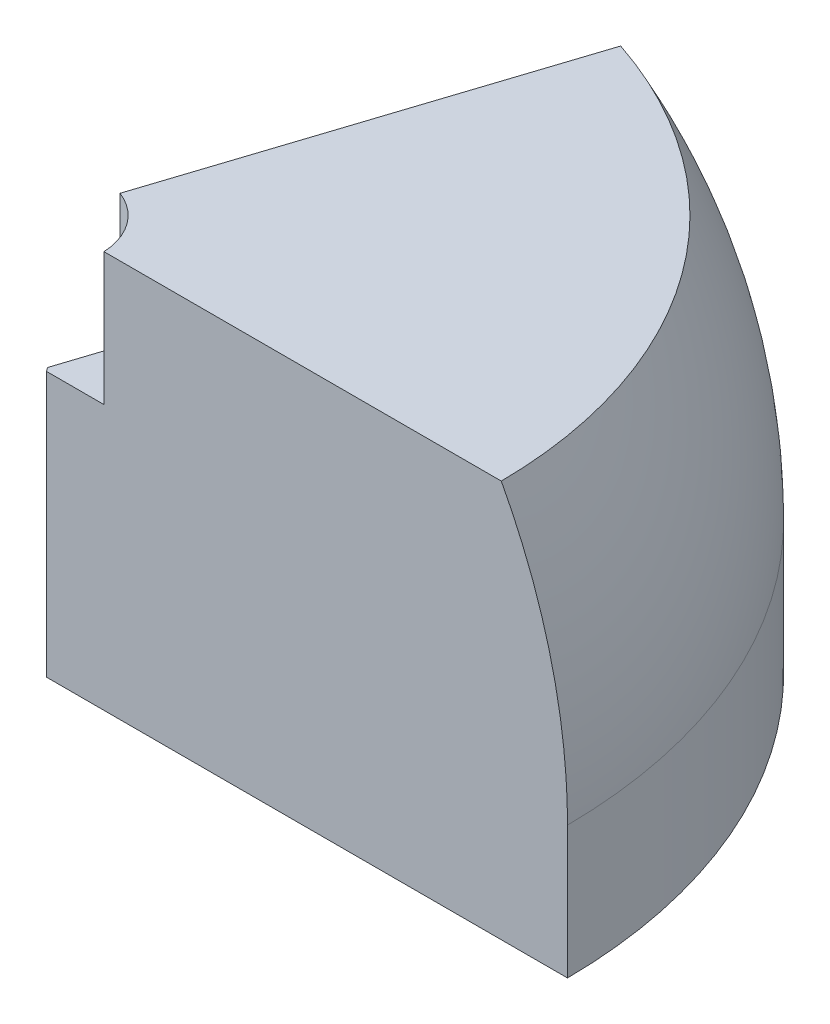
ISO-10303-21;
HEADER;
FILE_DESCRIPTION(('STEP AP214'),'2;1');
FILE_NAME('part.step','',(''),(''),'','','');
FILE_SCHEMA(('AUTOMOTIVE_DESIGN { 1 0 10303 214 1 1 1 1 }'));
ENDSEC;
DATA;
#1=APPLICATION_CONTEXT('core data for automotive mechanical design processes');
#2=APPLICATION_PROTOCOL_DEFINITION('international standard','automotive_design',2000,#1);
#3=PRODUCT_CONTEXT('',#1,'mechanical');
#4=PRODUCT('Part','Part','',(#3));
#5=PRODUCT_RELATED_PRODUCT_CATEGORY('part','',(#4));
#6=PRODUCT_DEFINITION_FORMATION('','',#4);
#7=PRODUCT_DEFINITION_CONTEXT('part definition',#1,'design');
#8=PRODUCT_DEFINITION('design','',#6,#7);
#9=PRODUCT_DEFINITION_SHAPE('','',#8);
#10=(LENGTH_UNIT() NAMED_UNIT(*) SI_UNIT(.MILLI.,.METRE.));
#11=(NAMED_UNIT(*) PLANE_ANGLE_UNIT() SI_UNIT($,.RADIAN.));
#12=(NAMED_UNIT(*) SI_UNIT($,.STERADIAN.) SOLID_ANGLE_UNIT());
#13=UNCERTAINTY_MEASURE_WITH_UNIT(LENGTH_MEASURE(1.E-05),#10,'distance_accuracy_value','');
#14=(GEOMETRIC_REPRESENTATION_CONTEXT(3) GLOBAL_UNCERTAINTY_ASSIGNED_CONTEXT((#13)) GLOBAL_UNIT_ASSIGNED_CONTEXT((#10,
#11,#12)) REPRESENTATION_CONTEXT('',''));
#15=CARTESIAN_POINT('',(0.,0.,0.));
#16=DIRECTION('',(0.,0.,1.));
#17=DIRECTION('',(1.,0.,0.));
#18=AXIS2_PLACEMENT_3D('',#15,#16,#17);
#19=CARTESIAN_POINT('',(0.,0.,0.));
#20=DIRECTION('',(0.,-1.,0.));
#21=DIRECTION('',(0.,0.,-1.));
#22=AXIS2_PLACEMENT_3D('',#19,#20,#21);
#23=PLANE('',#22);
#24=DIRECTION('',(-0.587785252292474,0.,-0.809016994374947));
#25=VECTOR('',#24,1.);
#26=CARTESIAN_POINT('',(1.65890568521156,0.,-0.635));
#27=LINE('',#26,#25);
#28=CARTESIAN_POINT('',(1.65890568521156,0.,-0.635));
#29=VERTEX_POINT('',#28);
#30=CARTESIAN_POINT('',(1.11655093664301,0.,-1.38148727041144));
#31=VERTEX_POINT('',#30);
#32=EDGE_CURVE('E93',#29,#31,#27,.T.);
#33=ORIENTED_EDGE('',*,*,#32,.T.);
#34=DIRECTION('',(-0.309016994374945,0.,0.951056516295154));
#35=VECTOR('',#34,1.);
#36=CARTESIAN_POINT('',(32.0000475163418,0.,-96.4311162641596));
#37=LINE('',#36,#35);
#38=CARTESIAN_POINT('',(31.9994343047552,0.,-96.4292289929545));
#39=VERTEX_POINT('',#38);
#40=EDGE_CURVE('E169',#39,#31,#37,.T.);
#41=ORIENTED_EDGE('',*,*,#40,.F.);
#42=CARTESIAN_POINT('',(0.,0.,0.));
#43=DIRECTION('',(0.,-1.,0.));
#44=DIRECTION('',(0.,0.,-1.));
#45=AXIS2_PLACEMENT_3D('',#42,#43,#44);
#46=CIRCLE('',#45,101.6);
#47=CARTESIAN_POINT('',(101.598015605621,0.,-0.635));
#48=VERTEX_POINT('',#47);
#49=EDGE_CURVE('E113',#39,#48,#46,.T.);
#50=ORIENTED_EDGE('',*,*,#49,.T.);
#51=DIRECTION('',(1.,0.,0.));
#52=VECTOR('',#51,1.);
#53=CARTESIAN_POINT('',(0.667678512391301,0.,-0.635));
#54=LINE('',#53,#52);
#55=EDGE_CURVE('E106',#29,#48,#54,.T.);
#56=ORIENTED_EDGE('',*,*,#55,.F.);
#57=EDGE_LOOP('',(#33,#41,#50,#56));
#58=FACE_BOUND('',#57,.T.);
#59=ADVANCED_FACE('F37',(#58),#23,.T.);
#60=CARTESIAN_POINT('',(0.,76.2,0.));
#61=DIRECTION('',(0.,1.,0.));
#62=DIRECTION('',(0.,0.,1.));
#63=AXIS2_PLACEMENT_3D('',#60,#61,#62);
#64=PLANE('',#63);
#65=CARTESIAN_POINT('',(0.,76.2,0.));
#66=DIRECTION('',(0.,1.,0.));
#67=DIRECTION('',(0.,0.,1.));
#68=AXIS2_PLACEMENT_3D('',#65,#66,#67);
#69=CIRCLE('',#68,12.7);
#70=CARTESIAN_POINT('',(12.6841150657032,76.2,-0.635));
#71=VERTEX_POINT('',#70);
#72=CARTESIAN_POINT('',(4.523528001757,76.2,-11.8670844952465));
#73=VERTEX_POINT('',#72);
#74=EDGE_CURVE('E101',#71,#73,#69,.T.);
#75=ORIENTED_EDGE('',*,*,#74,.F.);
#76=DIRECTION('',(-1.,0.,0.));
#77=VECTOR('',#76,1.);
#78=CARTESIAN_POINT('',(88.9,76.2,-0.635));
#79=LINE('',#78,#77);
#80=CARTESIAN_POINT('',(88.8977321139296,76.2,-0.635));
#81=VERTEX_POINT('',#80);
#82=EDGE_CURVE('E114',#81,#71,#79,.T.);
#83=ORIENTED_EDGE('',*,*,#82,.F.);
#84=CARTESIAN_POINT('',(0.,76.2,0.));
#85=DIRECTION('',(0.,-1.,0.));
#86=DIRECTION('',(0.,0.,-1.));
#87=AXIS2_PLACEMENT_3D('',#84,#85,#86);
#88=CIRCLE('',#87,88.9);
#89=CARTESIAN_POINT('',(28.074830872443,76.2,-84.3505416193857));
#90=VERTEX_POINT('',#89);
#91=EDGE_CURVE('E159',#90,#81,#88,.T.);
#92=ORIENTED_EDGE('',*,*,#91,.F.);
#93=DIRECTION('',(0.309016994374945,0.,-0.951056516295154));
#94=VECTOR('',#93,1.);
#95=CARTESIAN_POINT('',(0.603920887847423,76.2,0.19622579142809));
#96=LINE('',#95,#94);
#97=EDGE_CURVE('E132',#73,#90,#96,.T.);
#98=ORIENTED_EDGE('',*,*,#97,.F.);
#99=EDGE_LOOP('',(#75,#83,#92,#98));
#100=FACE_BOUND('',#99,.T.);
#101=ADVANCED_FACE('F39',(#100),#64,.T.);
#102=CARTESIAN_POINT('',(0.,25.3999999999999,0.));
#103=DIRECTION('',(0.,-1.,0.));
#104=DIRECTION('',(0.,0.,-1.));
#105=AXIS2_PLACEMENT_3D('',#102,#103,#104);
#106=DEGENERATE_TOROIDAL_SURFACE('',#105,6.35000000000034,107.95,.F.);
#107=ORIENTED_EDGE('',*,*,#91,.T.);
#108=CARTESIAN_POINT('',(95.2711124953083,61.8132104435301,-0.635));
#109=CARTESIAN_POINT('',(95.7810480913048,60.3901052430254,-0.635));
#110=CARTESIAN_POINT('',(96.2610539288999,58.9563653299823,-0.635));
#111=CARTESIAN_POINT('',(97.1603816988496,56.0701476801097,-0.635));
#112=CARTESIAN_POINT('',(97.5797119848334,54.6176725527361,-0.635));
#113=CARTESIAN_POINT('',(98.3570924929354,51.6960768749885,-0.635));
#114=CARTESIAN_POINT('',(98.7151288896013,50.226952648709,-0.635));
#115=CARTESIAN_POINT('',(99.3691924492126,47.2749056563987,-0.635));
#116=CARTESIAN_POINT('',(99.665217351682,45.7919823894152,-0.635));
#117=CARTESIAN_POINT('',(100.194988044725,42.813489364074,-0.635));
#118=CARTESIAN_POINT('',(100.428669864206,41.3179082279582,-0.635));
#119=CARTESIAN_POINT('',(100.832961619295,38.3181035771953,-0.635));
#120=CARTESIAN_POINT('',(101.003565693849,36.8138792726239,-0.635));
#121=CARTESIAN_POINT('',(101.281350844105,33.7997902496374,-0.635));
#122=CARTESIAN_POINT('',(101.388540460905,32.289926318385,-0.635));
#123=CARTESIAN_POINT('',(101.539350026058,29.2668856502316,-0.635));
#124=CARTESIAN_POINT('',(101.582964026544,27.7537086166321,-0.635));
#125=CARTESIAN_POINT('',(101.606558770675,24.7226724339604,-0.635));
#126=CARTESIAN_POINT('',(101.586363199197,23.2048119094799,-0.635));
#127=CARTESIAN_POINT('',(101.481984550683,20.1711501939732,-0.635));
#128=CARTESIAN_POINT('',(101.397795467588,18.6553492096213,-0.635));
#129=CARTESIAN_POINT('',(101.165581801395,15.6287679894556,-0.635));
#130=CARTESIAN_POINT('',(101.017562382343,14.1179873574435,-0.635));
#131=CARTESIAN_POINT('',(100.65793569996,11.1038705143466,-0.635));
#132=CARTESIAN_POINT('',(100.446322491211,9.60053501267452,-0.635));
#133=CARTESIAN_POINT('',(99.9600117756803,6.60488180603181,-0.635));
#134=CARTESIAN_POINT('',(99.6853462619025,5.11255890823832,-0.635));
#135=CARTESIAN_POINT('',(99.0733351847728,2.14068365644194,-0.635));
#136=CARTESIAN_POINT('',(98.7359837648581,0.661132509193489,-0.635));
#137=CARTESIAN_POINT('',(97.9992389774254,-2.2823157969116,-0.635));
#138=CARTESIAN_POINT('',(97.5998516885517,-3.7462144744852,-0.635));
#139=CARTESIAN_POINT('',(96.7397351060913,-6.65591946677251,-0.635));
#140=CARTESIAN_POINT('',(96.2790000748523,-8.10172407535388,-0.635));
#141=CARTESIAN_POINT('',(94.8061140089862,-12.4075415036295,-0.635));
#142=CARTESIAN_POINT('',(93.7030075102157,-15.2370540225823,-0.635));
#143=CARTESIAN_POINT('',(91.2625384569271,-20.7927697409796,-0.635));
#144=CARTESIAN_POINT('',(89.9251749119836,-23.5189725035771,-0.635));
#145=CARTESIAN_POINT('',(87.0247485377653,-28.850731769961,-0.635));
#146=CARTESIAN_POINT('',(85.4615470284069,-31.4562128343956,-0.635));
#147=CARTESIAN_POINT('',(82.1208926428598,-36.5264324326245,-0.635));
#148=CARTESIAN_POINT('',(80.343442032916,-38.9911724547173,-0.635));
#149=CARTESIAN_POINT('',(77.5263262920898,-42.5693836240272,-0.635));
#150=CARTESIAN_POINT('',(76.5617508808297,-43.7427113113559,-0.635));
#151=CARTESIAN_POINT('',(74.5839862987545,-46.0476012530404,-0.635));
#152=CARTESIAN_POINT('',(73.5708016910528,-47.1791674101202,-0.635));
#153=CARTESIAN_POINT('',(71.4974733629585,-49.3986711138708,-0.635));
#154=CARTESIAN_POINT('',(70.4373234361298,-50.4866028578701,-0.635));
#155=CARTESIAN_POINT('',(68.2721601181802,-52.6166710469498,-0.635));
#156=CARTESIAN_POINT('',(67.1671509467931,-53.6588117802965,-0.635));
#157=CARTESIAN_POINT('',(64.915757281705,-55.6940886305246,-0.635));
#158=CARTESIAN_POINT('',(63.7694340949832,-56.6872925695641,-0.635));
#159=CARTESIAN_POINT('',(61.4360701658038,-58.6244330765655,-0.635));
#160=CARTESIAN_POINT('',(60.2490332481996,-59.5683742516252,-0.635));
#161=CARTESIAN_POINT('',(57.8362949708537,-61.4053768319182,-0.635));
#162=CARTESIAN_POINT('',(56.610595114051,-62.2984402111391,-0.635));
#163=CARTESIAN_POINT('',(54.1227790601295,-64.0320604451131,-0.635));
#164=CARTESIAN_POINT('',(52.8606662755956,-64.8726221970508,-0.635));
#165=CARTESIAN_POINT('',(50.3031677600717,-66.4991937218983,-0.635));
#166=CARTESIAN_POINT('',(49.0078091501117,-67.2852461382857,-0.635));
#167=CARTESIAN_POINT('',(46.3852785619726,-68.802064205794,-0.635));
#168=CARTESIAN_POINT('',(45.0581095647242,-69.5328350108519,-0.635));
#169=CARTESIAN_POINT('',(42.3735162523584,-70.9382300778886,-0.635));
#170=CARTESIAN_POINT('',(41.0160770184915,-71.6128258422358,-0.635));
#171=CARTESIAN_POINT('',(38.2741253771229,-72.9042021911961,-0.635));
#172=CARTESIAN_POINT('',(36.8896155000491,-73.520988148649,-0.635));
#173=CARTESIAN_POINT('',(34.090998628362,-74.6977631954103,-0.635));
#174=CARTESIAN_POINT('',(32.6768054772168,-75.2575473899342,-0.635));
#175=CARTESIAN_POINT('',(29.8259722447488,-76.3168868402991,-0.635));
#176=CARTESIAN_POINT('',(28.3893312964972,-76.8164397634956,-0.635));
#177=CARTESIAN_POINT('',(25.4978982323404,-77.7538548150582,-0.635));
#178=CARTESIAN_POINT('',(24.0431288381479,-78.1917870801743,-0.635));
#179=CARTESIAN_POINT('',(21.1165479943607,-79.0058124248504,-0.635));
#180=CARTESIAN_POINT('',(19.6447388618844,-79.381913809061,-0.635));
#181=CARTESIAN_POINT('',(17.4176629879392,-79.9011915918739,-0.635));
#182=CARTESIAN_POINT('',(16.6677452932743,-80.0676230973435,-0.635));
#183=CARTESIAN_POINT('',(15.164473033656,-80.3844429117408,-0.635));
#184=CARTESIAN_POINT('',(14.411118278456,-80.5348303210866,-0.635));
#185=CARTESIAN_POINT('',(12.9001321452527,-80.8197061185371,-0.635));
#186=CARTESIAN_POINT('',(12.1424957944466,-80.9541681601784,-0.635));
#187=CARTESIAN_POINT('',(11.0041307079113,-81.1436488682889,-0.635));
#188=CARTESIAN_POINT('',(10.6244079318379,-81.2047663878569,-0.635));
#189=CARTESIAN_POINT('',(9.86433275791607,-81.3229293986458,-0.635));
#190=CARTESIAN_POINT('',(9.48398036836328,-81.3799749430871,-0.635));
#191=CARTESIAN_POINT('',(8.72511455093261,-81.4896330946228,-0.635));
#192=CARTESIAN_POINT('',(8.34660487115862,-81.5422716602101,-0.635));
#193=CARTESIAN_POINT('',(7.58902804443962,-81.643508829047,-0.635));
#194=CARTESIAN_POINT('',(7.20996087307135,-81.6921072495901,-0.635));
#195=CARTESIAN_POINT('',(6.45096617697169,-81.7852886756976,-0.635));
#196=CARTESIAN_POINT('',(6.07103817642873,-81.8298678054395,-0.635));
#197=CARTESIAN_POINT('',(5.3107825192673,-81.9149267759428,-0.635));
#198=CARTESIAN_POINT('',(4.93045493319227,-81.9554072468269,-0.635));
#199=CARTESIAN_POINT('',(4.17051371915147,-82.0321040041897,-0.635));
#200=CARTESIAN_POINT('',(3.79090133479739,-82.0683326222352,-0.635));
#201=CARTESIAN_POINT('',(3.03109637530374,-82.1365781732433,-0.635));
#202=CARTESIAN_POINT('',(2.65090360101674,-82.1685929041441,-0.635));
#203=CARTESIAN_POINT('',(2.08070271536255,-82.2130216925384,-0.635));
#204=CARTESIAN_POINT('',(1.89083256676978,-82.2272205000158,-0.635));
#205=CARTESIAN_POINT('',(1.51094383245492,-82.2542342152041,-0.635));
#206=CARTESIAN_POINT('',(1.32092522138634,-82.2670487733274,-0.635));
#207=CARTESIAN_POINT('',(1.03590773078068,-82.2846897614173,-0.635));
#208=CARTESIAN_POINT('',(0.940957870305231,-82.2903038596371,-0.635));
#209=CARTESIAN_POINT('',(0.751008737181598,-82.3007562694652,-0.635));
#210=CARTESIAN_POINT('',(0.656009461844908,-82.3055945331605,-0.635));
#211=CARTESIAN_POINT('',(0.466005110858149,-82.3140058678787,-0.635));
#212=CARTESIAN_POINT('',(0.371000068429646,-82.3175796479286,-0.635));
#213=CARTESIAN_POINT('',(0.18094157133351,-82.3225042437051,-0.635));
#214=CARTESIAN_POINT('',(0.0858881288259762,-82.3238554692885,-0.635));
#215=CARTESIAN_POINT('',(-0.0790275565434162,-82.3237130446451,-0.635));
#216=CARTESIAN_POINT('',(-0.148890681471754,-82.3228783677715,-0.635));
#217=CARTESIAN_POINT('',(-0.288590671614067,-82.319915546712,-0.635));
#218=CARTESIAN_POINT('',(-0.358427535355601,-82.3177873384468,-0.635));
#219=CARTESIAN_POINT('',(-0.498086797005905,-82.3126304026938,-0.635));
#220=CARTESIAN_POINT('',(-0.567909184774772,-82.3096014130661,-0.635));
#221=CARTESIAN_POINT('',(-0.707523514353663,-82.3029399863532,-0.635));
#222=CARTESIAN_POINT('',(-0.777315456571388,-82.299307557614,-0.635));
#223=CARTESIAN_POINT('',(-0.986777225124506,-82.2877847825757,-0.635));
#224=CARTESIAN_POINT('',(-1.12641262206724,-82.2792741418155,-0.635));
#225=CARTESIAN_POINT('',(-1.40561935127694,-82.261260355357,-0.635));
#226=CARTESIAN_POINT('',(-1.54519068274627,-82.2517571976208,-0.635));
#227=CARTESIAN_POINT('',(-1.96433217937074,-82.2220703675622,-0.635));
#228=CARTESIAN_POINT('',(-2.2438214643298,-82.2007397731893,-0.635));
#229=CARTESIAN_POINT('',(-2.8024788267206,-82.1556430414813,-0.635));
#230=CARTESIAN_POINT('',(-3.08164699105761,-82.1318779697365,-0.635));
#231=CARTESIAN_POINT('',(-3.64063974905581,-82.0819621498933,-0.635));
#232=CARTESIAN_POINT('',(-3.92046370508675,-82.0558042559793,-0.635));
#233=CARTESIAN_POINT('',(-4.47992755421622,-82.0012317646354,-0.635));
#234=CARTESIAN_POINT('',(-4.75956741903296,-81.9728168775704,-0.635));
#235=CARTESIAN_POINT('',(-5.31835277981636,-81.9137893934858,-0.635));
#236=CARTESIAN_POINT('',(-5.59749849374334,-81.8831788597321,-0.635));
#237=CARTESIAN_POINT('',(-6.15552884304028,-81.8197552845286,-0.635));
#238=CARTESIAN_POINT('',(-6.43441348785995,-81.7869423261918,-0.635));
#239=CARTESIAN_POINT('',(-6.99334841689845,-81.7189490364352,-0.635));
#240=CARTESIAN_POINT('',(-7.27339732771895,-81.6837574074854,-0.635));
#241=CARTESIAN_POINT('',(-7.83321119710798,-81.6111656013457,-0.635));
#242=CARTESIAN_POINT('',(-8.11297615252051,-81.5737653998764,-0.635));
#243=CARTESIAN_POINT('',(-8.95197431815274,-81.4582392931694,-0.635));
#244=CARTESIAN_POINT('',(-9.51075602332981,-81.3768067214924,-0.635));
#245=CARTESIAN_POINT('',(-10.6260182796668,-81.2053085766095,-0.635));
#246=CARTESIAN_POINT('',(-11.1825011276174,-81.1152579083696,-0.635));
#247=CARTESIAN_POINT('',(-12.2939352511488,-80.9264453857193,-0.635));
#248=CARTESIAN_POINT('',(-12.8488866622393,-80.8276843293187,-0.635));
#249=CARTESIAN_POINT('',(-13.9628721970605,-80.6204122150121,-0.635));
#250=CARTESIAN_POINT('',(-14.5218896073231,-80.5118113246404,-0.635));
#251=CARTESIAN_POINT('',(-15.6381500097204,-80.2857671908904,-0.635));
#252=CARTESIAN_POINT('',(-16.1953929506613,-80.1683236947676,-0.635));
#253=CARTESIAN_POINT('',(-17.3082629427017,-79.924559330632,-0.635));
#254=CARTESIAN_POINT('',(-17.8638889120226,-79.798233519811,-0.635));
#255=CARTESIAN_POINT('',(-18.9730599389536,-79.5367990096943,-0.635));
#256=CARTESIAN_POINT('',(-19.5266050134236,-79.4016903817218,-0.635));
#257=CARTESIAN_POINT('',(-21.1805117717206,-78.9840990659328,-0.635));
#258=CARTESIAN_POINT('',(-22.2776179147246,-78.6885900221431,-0.635));
#259=CARTESIAN_POINT('',(-24.4617363851326,-78.0631434918904,-0.635));
#260=CARTESIAN_POINT('',(-25.5487503610625,-77.7332117399921,-0.635));
#261=CARTESIAN_POINT('',(-28.0781530072034,-76.9216614638244,-0.635));
#262=CARTESIAN_POINT('',(-29.5162255170316,-76.4265122149214,-0.635));
#263=CARTESIAN_POINT('',(-32.3703120524934,-75.375843541916,-0.635));
#264=CARTESIAN_POINT('',(-33.7863233831151,-74.8203168071482,-0.635));
#265=CARTESIAN_POINT('',(-36.5956847396715,-73.649063723273,-0.635));
#266=CARTESIAN_POINT('',(-37.9889982993994,-73.0332498754798,-0.635));
#267=CARTESIAN_POINT('',(-40.7482667883657,-71.7432403169585,-0.635));
#268=CARTESIAN_POINT('',(-42.1142227292083,-71.0690467698653,-0.635));
#269=CARTESIAN_POINT('',(-44.8078385642773,-69.6679116782019,-0.635));
#270=CARTESIAN_POINT('',(-46.1356860132235,-68.9413306725376,-0.635));
#271=CARTESIAN_POINT('',(-48.7596628315827,-67.4329788883098,-0.635));
#272=CARTESIAN_POINT('',(-50.0557920870211,-66.6512079114689,-0.635));
#273=CARTESIAN_POINT('',(-52.6133546193354,-65.0342917413042,-0.635));
#274=CARTESIAN_POINT('',(-53.8748059774075,-64.1991751476815,-0.635));
#275=CARTESIAN_POINT('',(-56.3614976390038,-62.4766726227644,-0.635));
#276=CARTESIAN_POINT('',(-57.5867380323282,-61.5892868211096,-0.635));
#277=CARTESIAN_POINT('',(-60.0010885312287,-59.7621150380038,-0.635));
#278=CARTESIAN_POINT('',(-61.1901272589455,-58.8222347386303,-0.635));
#279=CARTESIAN_POINT('',(-63.527683174307,-56.8931646651132,-0.635));
#280=CARTESIAN_POINT('',(-64.6761968182612,-55.9039705969171,-0.635));
#281=CARTESIAN_POINT('',(-66.9306513264697,-53.8780179262939,-0.635));
#282=CARTESIAN_POINT('',(-68.0365886169272,-52.8412553469754,-0.635));
#283=CARTESIAN_POINT('',(-70.2039285673898,-50.7219825044592,-0.635));
#284=CARTESIAN_POINT('',(-71.2653270414973,-49.6394679604534,-0.635));
#285=CARTESIAN_POINT('',(-73.3439773114582,-47.4281695718086,-0.635));
#286=CARTESIAN_POINT('',(-74.3611223071742,-46.2992853308351,-0.635));
#287=CARTESIAN_POINT('',(-76.3469515283308,-43.9994835884352,-0.635));
#288=CARTESIAN_POINT('',(-77.3156311885404,-42.8285621450568,-0.635));
#289=CARTESIAN_POINT('',(-79.2025639144736,-40.4470459139958,-0.635));
#290=CARTESIAN_POINT('',(-80.1208242695115,-39.236456901831,-0.635));
#291=CARTESIAN_POINT('',(-81.9055167346122,-36.777487277962,-0.635));
#292=CARTESIAN_POINT('',(-82.7719439846736,-35.5291031389686,-0.635));
#293=CARTESIAN_POINT('',(-84.4506202248772,-32.9979495244189,-0.635));
#294=CARTESIAN_POINT('',(-85.2629145935085,-31.7152101457757,-0.635));
#295=CARTESIAN_POINT('',(-86.8327541823185,-29.1165007500258,-0.635));
#296=CARTESIAN_POINT('',(-87.5902942717655,-27.8005276343134,-0.635));
#297=CARTESIAN_POINT('',(-89.0491462283248,-25.1378809162212,-0.635));
#298=CARTESIAN_POINT('',(-89.7504625783451,-23.7912097725169,-0.635));
#299=CARTESIAN_POINT('',(-91.0957075148148,-21.0694607104991,-0.635));
#300=CARTESIAN_POINT('',(-91.7396307311013,-19.6943801487689,-0.635));
#301=CARTESIAN_POINT('',(-93.5823765856159,-15.5327169491882,-0.635));
#302=CARTESIAN_POINT('',(-94.6937775227184,-12.7067876783074,-0.635));
#303=CARTESIAN_POINT('',(-96.6745010355704,-6.97177465527589,-0.635));
#304=CARTESIAN_POINT('',(-97.543824709381,-4.06269128037779,-0.635));
#305=CARTESIAN_POINT('',(-99.0346746809904,1.81928837192862,-0.635));
#306=CARTESIAN_POINT('',(-99.6561302749467,4.79220260247231,-0.635));
#307=CARTESIAN_POINT('',(-100.646410233531,10.7797890304668,-0.635));
#308=CARTESIAN_POINT('',(-101.015234170382,13.794461298617,-0.635));
#309=CARTESIAN_POINT('',(-101.497707994757,19.8449595182587,-0.635));
#310=CARTESIAN_POINT('',(-101.611291012634,22.8807908042123,-0.635));
#311=CARTESIAN_POINT('',(-101.582273581143,28.9512259274789,-0.635));
#312=CARTESIAN_POINT('',(-101.439673194515,31.9858297650924,-0.635));
#313=CARTESIAN_POINT('',(-100.899320099634,38.0320584867742,-0.635));
#314=CARTESIAN_POINT('',(-100.501582150748,41.0436846898712,-0.635));
#315=CARTESIAN_POINT('',(-99.4537954829564,47.0227213951505,-0.635));
#316=CARTESIAN_POINT('',(-98.8037467587013,49.9901318963954,-0.635));
#317=CARTESIAN_POINT('',(-97.2560729544157,55.8592123066664,-0.635));
#318=CARTESIAN_POINT('',(-96.3584837268165,58.7608916700271,-0.635));
#319=CARTESIAN_POINT('',(-94.3220694035657,64.4783261937802,-0.635));
#320=CARTESIAN_POINT('',(-93.18324444786,67.2940814040179,-0.635));
#321=CARTESIAN_POINT('',(-90.67251528456,72.8195178116754,-0.635));
#322=CARTESIAN_POINT('',(-89.3006225398616,75.5292042177816,-0.635));
#323=CARTESIAN_POINT('',(-86.3334674521962,80.8233941420738,-0.635));
#324=CARTESIAN_POINT('',(-84.7382047313831,83.4078974484938,-0.635));
#325=CARTESIAN_POINT('',(-81.3352345309942,88.4339596698516,-0.635));
#326=CARTESIAN_POINT('',(-79.527475344171,90.8754835758538,-0.635));
#327=CARTESIAN_POINT('',(-75.7126898766286,95.597527957486,-0.635));
#328=CARTESIAN_POINT('',(-73.7056647063437,97.8780493302014,-0.635));
#329=CARTESIAN_POINT('',(-69.5064234839253,102.2620820063,-0.635));
#330=CARTESIAN_POINT('',(-67.3141909435914,104.365577516501,-0.635));
#331=CARTESIAN_POINT('',(-62.7602315711704,108.380413176579,-0.635));
#332=CARTESIAN_POINT('',(-60.398501110138,110.291749210223,-0.635));
#333=CARTESIAN_POINT('',(-55.5233893427259,113.907875066912,-0.635));
#334=CARTESIAN_POINT('',(-53.0100707409192,115.612749427062,-0.635));
#335=CARTESIAN_POINT('',(-47.848963388213,118.804623885265,-0.635));
#336=CARTESIAN_POINT('',(-45.2011851158756,120.291640926151,-0.635));
#337=CARTESIAN_POINT('',(-39.7893528742326,123.037616299638,-0.635));
#338=CARTESIAN_POINT('',(-37.025279438881,124.296536263609,-0.635));
#339=CARTESIAN_POINT('',(-31.4001027764286,126.577375395366,-0.635));
#340=CARTESIAN_POINT('',(-28.5389736438028,127.599230707592,-0.635));
#341=CARTESIAN_POINT('',(-22.7403241250101,129.398361818582,-0.635));
#342=CARTESIAN_POINT('',(-19.8027872488296,130.175584339492,-0.635));
#343=CARTESIAN_POINT('',(-13.8746373767884,131.479160851853,-0.635));
#344=CARTESIAN_POINT('',(-10.8840740957542,132.005738143516,-0.635));
#345=CARTESIAN_POINT('',(-7.22271718175602,132.491855890683,-0.635));
#346=CARTESIAN_POINT('',(-6.56686894586874,132.572782295864,-0.635));
#347=CARTESIAN_POINT('',(-5.25342837060698,132.722495405253,-0.635));
#348=CARTESIAN_POINT('',(-4.59583534368585,132.791276247474,-0.635));
#349=CARTESIAN_POINT('',(-3.77361105212141,132.869372950466,-0.635));
#350=CARTESIAN_POINT('',(-3.60952056697888,132.884565896573,-0.635));
#351=CARTESIAN_POINT('',(-3.28126650505741,132.914155833571,-0.635));
#352=CARTESIAN_POINT('',(-3.11710292797585,132.928552821135,-0.635));
#353=CARTESIAN_POINT('',(-2.78865518440501,132.95653176667,-0.635));
#354=CARTESIAN_POINT('',(-2.62437099631104,132.970113470681,-0.635));
#355=CARTESIAN_POINT('',(-2.29573807103158,132.996409711731,-0.635));
#356=CARTESIAN_POINT('',(-2.13138933591043,133.009124274538,-0.635));
#357=CARTESIAN_POINT('',(-1.80280367336048,133.033583174219,-0.635));
#358=CARTESIAN_POINT('',(-1.6385668259642,133.045328578475,-0.635));
#359=CARTESIAN_POINT('',(-1.39213909996481,133.062050748506,-0.635));
#360=CARTESIAN_POINT('',(-1.30997860663919,133.0674758362,-0.635));
#361=CARTESIAN_POINT('',(-1.14563442011722,133.077959644019,-0.635));
#362=CARTESIAN_POINT('',(-1.06345072701103,133.083018365549,-0.635));
#363=CARTESIAN_POINT('',(-0.899107669961999,133.092652372784,-0.635));
#364=CARTESIAN_POINT('',(-0.816948324287882,133.097227966857,-0.635));
#365=CARTESIAN_POINT('',(-0.652590097788548,133.105682180429,-0.635));
#366=CARTESIAN_POINT('',(-0.570391215669501,133.109560775306,-0.635));
#367=CARTESIAN_POINT('',(-0.405973378324718,133.116214669494,-0.635));
#368=CARTESIAN_POINT('',(-0.323754438569106,133.118990330907,-0.635));
#369=CARTESIAN_POINT('',(-0.159284161631871,133.122791348222,-0.635));
#370=CARTESIAN_POINT('',(-0.0770328314558424,133.123816975618,-0.635));
#371=CARTESIAN_POINT('',(0.0721820220989415,133.123743143543,-0.635));
#372=CARTESIAN_POINT('',(0.139145855540466,133.123003200317,-0.635));
#373=CARTESIAN_POINT('',(0.273050250760686,133.120313408143,-0.635));
#374=CARTESIAN_POINT('',(0.339990811401848,133.118363506627,-0.635));
#375=CARTESIAN_POINT('',(0.47385416523448,133.113601677355,-0.635));
#376=CARTESIAN_POINT('',(0.540776951558924,133.11078956523,-0.635));
#377=CARTESIAN_POINT('',(0.674593867365537,133.10457817551,-0.635));
#378=CARTESIAN_POINT('',(0.741487997157206,133.101178904424,-0.635));
#379=CARTESIAN_POINT('',(0.942231051443081,133.09037103298,-0.635));
#380=CARTESIAN_POINT('',(1.07604702732504,133.082356282468,-0.635));
#381=CARTESIAN_POINT('',(1.34360098289807,133.065367339481,-0.635));
#382=CARTESIAN_POINT('',(1.47733896975098,133.056393256677,-0.635));
#383=CARTESIAN_POINT('',(1.87893559574853,133.028353618548,-0.635));
#384=CARTESIAN_POINT('',(2.146718393954,133.008197699487,-0.635));
#385=CARTESIAN_POINT('',(2.68200466940328,132.965615336843,-0.635));
#386=CARTESIAN_POINT('',(2.94950821240516,132.943189710817,-0.635));
#387=CARTESIAN_POINT('',(3.48517799654182,132.896127512143,-0.635));
#388=CARTESIAN_POINT('',(3.75334364045499,132.87148413646,-0.635));
#389=CARTESIAN_POINT('',(4.28950410658832,132.820116932605,-0.635));
#390=CARTESIAN_POINT('',(4.55749890761437,132.793392883508,-0.635));
#391=CARTESIAN_POINT('',(5.09304637274005,132.737920110243,-0.635));
#392=CARTESIAN_POINT('',(5.36059921888897,132.709173144771,-0.635));
#393=CARTESIAN_POINT('',(5.89547028396929,132.649652788618,-0.635));
#394=CARTESIAN_POINT('',(6.1627885099964,132.618879461523,-0.635));
#395=CARTESIAN_POINT('',(6.96736867091704,132.523179882824,-0.635));
#396=CARTESIAN_POINT('',(7.50426880919331,132.455183582086,-0.635));
#397=CARTESIAN_POINT('',(8.57712529030077,132.311067667883,-0.635));
#398=CARTESIAN_POINT('',(9.11308133338082,132.234945828233,-0.635));
#399=CARTESIAN_POINT('',(10.182837773443,132.074767875751,-0.635));
#400=CARTESIAN_POINT('',(10.7166403065419,131.99072603619,-0.635));
#401=CARTESIAN_POINT('',(11.7828735937276,131.814629842695,-0.635));
#402=CARTESIAN_POINT('',(12.3153044643374,131.722576194138,-0.635));
#403=CARTESIAN_POINT('',(13.3848233032018,131.529373148859,-0.635));
#404=CARTESIAN_POINT('',(13.9218946117549,131.428131507286,-0.635));
#405=CARTESIAN_POINT('',(14.9944507392931,131.217493556122,-0.635));
#406=CARTESIAN_POINT('',(15.5299355138286,131.108097020262,-0.635));
#407=CARTESIAN_POINT('',(16.5995028470587,130.881110242614,-0.635));
#408=CARTESIAN_POINT('',(17.1335843716172,130.76351512386,-0.635));
#409=CARTESIAN_POINT('',(18.199888533812,130.520220682532,-0.635));
#410=CARTESIAN_POINT('',(18.7321111860747,130.394521423877,-0.635));
#411=CARTESIAN_POINT('',(20.32213090543,130.00620867067,-0.635));
#412=CARTESIAN_POINT('',(21.377024677903,129.731585196092,-0.635));
#413=CARTESIAN_POINT('',(23.4777860586028,129.150572335328,-0.635));
#414=CARTESIAN_POINT('',(24.5236552648807,128.844188703622,-0.635));
#415=CARTESIAN_POINT('',(27.0177843677307,128.072339306415,-0.635));
#416=CARTESIAN_POINT('',(28.4614442825478,127.591910643787,-0.635));
#417=CARTESIAN_POINT('',(31.3273318745514,126.570406088448,-0.635));
#418=CARTESIAN_POINT('',(32.7495566220874,126.029321989419,-0.635));
#419=CARTESIAN_POINT('',(35.5723020279832,124.886533803611,-0.635));
#420=CARTESIAN_POINT('',(36.9727810636421,124.284726865307,-0.635));
#421=CARTESIAN_POINT('',(39.7469418463873,123.022380582145,-0.635));
#422=CARTESIAN_POINT('',(41.1206247111053,122.361843693246,-0.635));
#423=CARTESIAN_POINT('',(43.8286996783362,120.988320050552,-0.635));
#424=CARTESIAN_POINT('',(45.1633077687953,120.275759106784,-0.635));
#425=CARTESIAN_POINT('',(47.8014046266443,118.795176846769,-0.635));
#426=CARTESIAN_POINT('',(49.1048932857839,118.027155337639,-0.635));
#427=CARTESIAN_POINT('',(51.6776157268933,116.437522837931,-0.635));
#428=CARTESIAN_POINT('',(52.9468709840597,115.615946603223,-0.635));
#429=CARTESIAN_POINT('',(55.4497534296433,113.920215633145,-0.635));
#430=CARTESIAN_POINT('',(56.6833807224412,113.046061051838,-0.635));
#431=CARTESIAN_POINT('',(59.1159526283389,111.244404271234,-0.635));
#432=CARTESIAN_POINT('',(60.3148001093398,110.31677092137,-0.635));
#433=CARTESIAN_POINT('',(62.6724770691583,108.411765557432,-0.635));
#434=CARTESIAN_POINT('',(63.8313030214006,107.434389178829,-0.635));
#435=CARTESIAN_POINT('',(66.1069444204762,105.431553658402,-0.635));
#436=CARTESIAN_POINT('',(67.2237534380015,104.406087211473,-0.635));
#437=CARTESIAN_POINT('',(69.4133184663143,102.308909322436,-0.635));
#438=CARTESIAN_POINT('',(70.4860693931532,101.237192572514,-0.635));
#439=CARTESIAN_POINT('',(72.5876946582178,99.0472159005977,-0.635));
#440=CARTESIAN_POINT('',(73.6164716392084,97.9288625424783,-0.635));
#441=CARTESIAN_POINT('',(75.6257888436444,95.649861782934,-0.635));
#442=CARTESIAN_POINT('',(76.6063344621856,94.4892191373307,-0.635));
#443=CARTESIAN_POINT('',(78.5174224879801,92.1277593932023,-0.635));
#444=CARTESIAN_POINT('',(79.4479730212577,90.9269488752178,-0.635));
#445=CARTESIAN_POINT('',(81.2575051387454,88.4872407934417,-0.635));
#446=CARTESIAN_POINT('',(82.1364885245954,87.2483445625866,-0.635));
#447=CARTESIAN_POINT('',(84.261492087424,84.1151065997551,-0.635));
#448=CARTESIAN_POINT('',(85.4750240058764,82.1985177039443,-0.635));
#449=CARTESIAN_POINT('',(87.202659416868,79.2697986714063,-0.635));
#450=CARTESIAN_POINT('',(87.7630663740922,78.284641046658,-0.635));
#451=CARTESIAN_POINT('',(88.8526701570979,76.2970192960934,-0.635));
#452=CARTESIAN_POINT('',(89.3818625785555,75.2945527536886,-0.635));
#453=CARTESIAN_POINT('',(90.9206754773388,72.2648512399464,-0.635));
#454=CARTESIAN_POINT('',(91.8827589883532,70.2132332946207,-0.635));
#455=CARTESIAN_POINT('',(93.6759975784986,66.0534394843506,-0.635));
#456=CARTESIAN_POINT('',(94.5071437767272,63.9452597944112,-0.635));
#457=CARTESIAN_POINT('',(95.2711124953083,61.8132104435301,-0.635));
#458=B_SPLINE_CURVE_WITH_KNOTS('',3,(#108,#109,#110,#111,#112,#113,#114,#115,#116,#117,#118,
#119,#120,#121,#122,#123,#124,#125,#126,#127,#128,#129,#130,#131,#132,#133,#134,#135,#136,#137,
#138,#139,#140,#141,#142,#143,#144,#145,#146,#147,#148,#149,#150,#151,#152,#153,#154,#155,#156,
#157,#158,#159,#160,#161,#162,#163,#164,#165,#166,#167,#168,#169,#170,#171,#172,#173,#174,#175,
#176,#177,#178,#179,#180,#181,#182,#183,#184,#185,#186,#187,#188,#189,#190,#191,#192,#193,#194,
#195,#196,#197,#198,#199,#200,#201,#202,#203,#204,#205,#206,#207,#208,#209,#210,#211,#212,#213,
#214,#215,#216,#217,#218,#219,#220,#221,#222,#223,#224,#225,#226,#227,#228,#229,#230,#231,#232,
#233,#234,#235,#236,#237,#238,#239,#240,#241,#242,#243,#244,#245,#246,#247,#248,#249,#250,#251,
#252,#253,#254,#255,#256,#257,#258,#259,#260,#261,#262,#263,#264,#265,#266,#267,#268,#269,#270,
#271,#272,#273,#274,#275,#276,#277,#278,#279,#280,#281,#282,#283,#284,#285,#286,#287,#288,#289,
#290,#291,#292,#293,#294,#295,#296,#297,#298,#299,#300,#301,#302,#303,#304,#305,#306,#307,#308,
#309,#310,#311,#312,#313,#314,#315,#316,#317,#318,#319,#320,#321,#322,#323,#324,#325,#326,#327,
#328,#329,#330,#331,#332,#333,#334,#335,#336,#337,#338,#339,#340,#341,#342,#343,#344,#345,#346,
#347,#348,#349,#350,#351,#352,#353,#354,#355,#356,#357,#358,#359,#360,#361,#362,#363,#364,#365,
#366,#367,#368,#369,#370,#371,#372,#373,#374,#375,#376,#377,#378,#379,#380,#381,#382,#383,#384,
#385,#386,#387,#388,#389,#390,#391,#392,#393,#394,#395,#396,#397,#398,#399,#400,#401,#402,#403,
#404,#405,#406,#407,#408,#409,#410,#411,#412,#413,#414,#415,#416,#417,#418,#419,#420,#421,#422,
#423,#424,#425,#426,#427,#428,#429,#430,#431,#432,#433,#434,#435,#436,#437,#438,#439,#440,#441,
#442,#443,#444,#445,#446,#447,#448,#449,#450,#451,#452,#453,#454,#455,#456,#457),.UNSPECIFIED.,
.T.,.F.,(4,2,2,2,2,2,2,2,2,2,2,2,2,2,2,2,2,2,2,2,2,2,2,2,2,2,2,2,2,2,2,2,2,2,2,2,2,2,2,2,2,2,2,
2,2,2,2,2,2,2,2,2,2,2,2,2,2,2,2,2,2,2,2,2,2,2,2,2,2,2,2,2,2,2,2,2,2,2,2,2,2,2,2,2,2,2,2,2,2,2,2,
2,2,2,2,2,2,2,2,2,2,2,2,2,2,2,2,2,2,2,2,2,2,2,2,2,2,2,2,2,2,2,2,2,2,2,2,2,2,2,2,2,2,2,2,2,2,2,2,
2,2,2,2,2,2,2,2,2,2,2,2,2,2,2,2,2,2,2,2,2,2,2,2,2,2,2,2,2,2,2,2,2,2,2,4),(0.,4.5346457163523,
9.06866652094642,13.6037086758376,18.1389161157334,22.6787594497122,27.2190245106044,
31.7586779179742,36.2987560089906,40.8513899554518,45.4044512384853,49.9571442357737,
54.5102629992741,59.0610765777633,63.6123155395634,68.1631088248342,72.7143280301663,
81.8133873963876,90.9124852338347,100.017194483276,109.121807435041,113.677445445155,
118.232656635367,122.788471599963,127.34385900535,131.892744416956,136.441203647554,
140.989486283909,145.537344035418,150.081602826182,154.625437429561,159.171563255601,
163.71726614516,168.278771126394,172.840452709467,177.396899434983,181.95273367257,
184.257080834698,186.561557132199,188.869794154383,190.023605493203,191.177401749011,
192.323837296284,193.470324660397,194.617906020859,195.765310684832,196.909300708919,
198.053886197219,198.625084084928,199.196425891233,199.481771003774,199.767133731451,
200.052336194714,200.33748605847,200.547075082214,200.756674489479,200.966334952866,
201.175992516736,201.595669066283,202.01535070651,202.856241776683,203.696766342155,
204.53988849914,205.383119027581,206.225567292642,207.067983784034,207.914728693389,
208.761482912969,210.455459138452,212.146556835726,213.837499762207,215.545834204438,
217.254217493817,218.963559101157,220.672886829036,224.080881111316,227.488308551147,
232.049669190923,236.611582748889,241.180218342165,245.748684687697,250.288260233718,
254.827852089611,259.365030276354,263.90219721033,268.447796213895,272.993791724378,
277.540167990761,282.086970587201,286.644198179279,291.201854237967,295.758849634239,
300.316271638258,304.869823900885,309.423802300919,313.977417235047,318.531457795687,
327.629565396077,336.727631726829,345.828291408798,354.928966500726,364.032025567857,
373.13508240566,382.237612691247,391.340143169825,400.441355978726,409.542563507833,
418.643323544778,427.74409897648,436.847093522704,445.950037344212,455.053792416608,
464.157742458305,473.257952132148,482.357453703622,491.458484500799,500.561963906033,
509.667424561594,518.764757894594,520.747189262409,522.730574839799,523.224951415012,
523.719330056412,524.213861905052,524.708379050701,525.202344081055,525.44936171254,
525.696378397043,525.943236451583,526.190103224722,526.436888882656,526.683636251807,
526.884526436266,527.085425349114,527.286367250791,527.487306924566,527.889467334492,
528.291581818787,529.097188615181,529.902506254805,530.710384415897,531.518348474205,
532.32561857699,533.132863360413,534.756361824179,536.380306231533,538.001378014381,
539.622307218843,541.261834813008,542.901407915027,544.541964786522,546.182508720128,
549.452116096895,552.721132100288,557.284199891844,561.847885785946,566.419435657942,
570.990794447373,575.528214277634,580.065649889207,584.600169568014,589.134675960515,
593.680819411268,598.227362437524,602.774598356113,607.322357523205,611.879712616103,
616.436556764619,620.9926580051,625.54859997076,632.348808804053,635.748545962725,
639.148761677306,645.941958016655,652.735614910464),.UNSPECIFIED.);
#459=CARTESIAN_POINT('',(101.598015605621,25.4,-0.635));
#460=VERTEX_POINT('',#459);
#461=EDGE_CURVE('E126',#81,#460,#458,.T.);
#462=ORIENTED_EDGE('',*,*,#461,.T.);
#463=CARTESIAN_POINT('',(0.,25.4,0.));
#464=DIRECTION('',(0.,-1.,0.));
#465=DIRECTION('',(0.,0.,-1.));
#466=AXIS2_PLACEMENT_3D('',#463,#464,#465);
#467=CIRCLE('',#466,101.6);
#468=CARTESIAN_POINT('',(31.9994343047552,25.4,-96.4292289929545));
#469=VERTEX_POINT('',#468);
#470=EDGE_CURVE('E156',#469,#460,#467,.T.);
#471=ORIENTED_EDGE('',*,*,#470,.F.);
#472=CARTESIAN_POINT('',(31.9994343046979,25.3998,-96.4292289927783));
#473=CARTESIAN_POINT('',(31.9994417586177,26.9324463851088,-96.4292519335845));
#474=CARTESIAN_POINT('',(31.989349741781,28.4650914652759,-96.3981918995093));
#475=CARTESIAN_POINT('',(31.9490137204242,31.5276186988383,-96.2740503906243));
#476=CARTESIAN_POINT('',(31.9187695014563,33.0575008226582,-96.1809682558122));
#477=CARTESIAN_POINT('',(31.838161048792,36.1122768812056,-95.9328809480902));
#478=CARTESIAN_POINT('',(31.7877893384578,37.6371687497806,-95.7778527644549));
#479=CARTESIAN_POINT('',(31.6670201370774,40.6786048555945,-95.4061633815688));
#480=CARTESIAN_POINT('',(31.5966229368096,42.1951492137166,-95.1895030772416));
#481=CARTESIAN_POINT('',(31.4375506555761,45.186678844504,-94.6999289360683));
#482=CARTESIAN_POINT('',(31.349272790096,46.6618854724898,-94.4282376027831));
#483=CARTESIAN_POINT('',(31.1537671297582,49.5990889057013,-93.8265330505367));
#484=CARTESIAN_POINT('',(31.0465393803116,51.061085742574,-93.4965199713368));
#485=CARTESIAN_POINT('',(30.8133721170771,53.9686834317406,-92.7789049238717));
#486=CARTESIAN_POINT('',(30.6874408086877,55.4142911762188,-92.3913282092267));
#487=CARTESIAN_POINT('',(30.4170632479685,58.2871119455904,-91.5591916417795));
#488=CARTESIAN_POINT('',(30.2726188383068,59.71432678565,-91.1146374601269));
#489=CARTESIAN_POINT('',(29.9792651313207,62.4206399795265,-90.2117875855664));
#490=CARTESIAN_POINT('',(29.8319239980915,63.7015214879205,-89.7583182054781));
#491=CARTESIAN_POINT('',(29.5223509559072,66.2440055331829,-88.805550349994));
#492=CARTESIAN_POINT('',(29.3601220870842,67.5056119449921,-88.3062612311629));
#493=CARTESIAN_POINT('',(29.0193944806147,70.019693287576,-87.2576094860708));
#494=CARTESIAN_POINT('',(28.8407577101563,71.2719723187068,-86.7078220384966));
#495=CARTESIAN_POINT('',(28.4687537882867,73.7537217174616,-85.5629116923941));
#496=CARTESIAN_POINT('',(28.2753836249346,74.9831873571279,-84.9677795240644));
#497=CARTESIAN_POINT('',(28.074797909706,76.2002,-84.3504401705128));
#498=B_SPLINE_CURVE_WITH_KNOTS('',3,(#472,#473,#474,#475,#476,#477,#478,#479,#480,#481,#482,
#483,#484,#485,#486,#487,#488,#489,#490,#491,#492,#493,#494,#495,#496,#497),.UNSPECIFIED.,.F.,
.F.,(4,2,2,2,2,2,2,2,2,2,2,2,4),(0.,4.59758936218162,9.1952276499555,13.7945753847618,
18.3938563385685,22.9003891757954,27.406911213789,31.9114620131943,36.4155648079203,
40.5148420711945,44.6132841012702,48.7500750510301,52.8877139639548),.UNSPECIFIED.);
#499=EDGE_CURVE('E60',#469,#90,#498,.T.);
#500=ORIENTED_EDGE('',*,*,#499,.T.);
#501=EDGE_LOOP('',(#107,#462,#471,#500));
#502=FACE_BOUND('',#501,.T.);
#503=ADVANCED_FACE('F134',(#502),#106,.F.);
#504=CARTESIAN_POINT('',(0.,0.,0.));
#505=DIRECTION('',(0.,-1.,0.));
#506=DIRECTION('',(0.,0.,-1.));
#507=AXIS2_PLACEMENT_3D('',#504,#505,#506);
#508=CYLINDRICAL_SURFACE('',#507,101.6);
#509=ORIENTED_EDGE('',*,*,#470,.T.);
#510=DIRECTION('',(0.,-1.,0.));
#511=VECTOR('',#510,1.);
#512=CARTESIAN_POINT('',(101.598015605621,0.,-0.635));
#513=LINE('',#512,#511);
#514=EDGE_CURVE('E118',#460,#48,#513,.T.);
#515=ORIENTED_EDGE('',*,*,#514,.T.);
#516=ORIENTED_EDGE('',*,*,#49,.F.);
#517=DIRECTION('',(0.,-1.,0.));
#518=VECTOR('',#517,1.);
#519=CARTESIAN_POINT('',(31.9994343047552,0.,-96.4292289929545));
#520=LINE('',#519,#518);
#521=EDGE_CURVE('E154',#39,#469,#520,.F.);
#522=ORIENTED_EDGE('',*,*,#521,.T.);
#523=EDGE_LOOP('',(#509,#515,#516,#522));
#524=FACE_BOUND('',#523,.T.);
#525=ADVANCED_FACE('F147',(#524),#508,.T.);
#526=CARTESIAN_POINT('',(-1.35833702643358,25.3999999999999,6.23543466990265));
#527=DIRECTION('',(-0.951056516295154,0.,-0.309016994374945));
#528=DIRECTION('',(-0.309016994374945,0.,0.951056516295154));
#529=AXIS2_PLACEMENT_3D('',#526,#527,#528);
#530=PLANE('',#529);
#531=DIRECTION('',(0.,1.,0.));
#532=VECTOR('',#531,1.);
#533=CARTESIAN_POINT('',(1.11655093664301,-0.001000000000001,-1.38148727041144));
#534=LINE('',#533,#532);
#535=CARTESIAN_POINT('',(1.11655093664301,50.8,-1.38148727041144));
#536=VERTEX_POINT('',#535);
#537=EDGE_CURVE('E96',#31,#536,#534,.T.);
#538=ORIENTED_EDGE('',*,*,#537,.T.);
#539=DIRECTION('',(0.309016994374945,0.,-0.951056516295154));
#540=VECTOR('',#539,1.);
#541=CARTESIAN_POINT('',(-1.35833702643358,50.8,6.23543466990265));
#542=LINE('',#541,#540);
#543=CARTESIAN_POINT('',(4.523528001757,50.8,-11.8670844952465));
#544=VERTEX_POINT('',#543);
#545=EDGE_CURVE('E121',#536,#544,#542,.T.);
#546=ORIENTED_EDGE('',*,*,#545,.T.);
#547=DIRECTION('',(0.,1.,0.));
#548=VECTOR('',#547,1.);
#549=CARTESIAN_POINT('',(4.523528001757,50.8,-11.8670844952465));
#550=LINE('',#549,#548);
#551=EDGE_CURVE('E115',#73,#544,#550,.F.);
#552=ORIENTED_EDGE('',*,*,#551,.F.);
#553=ORIENTED_EDGE('',*,*,#97,.T.);
#554=ORIENTED_EDGE('',*,*,#499,.F.);
#555=ORIENTED_EDGE('',*,*,#521,.F.);
#556=ORIENTED_EDGE('',*,*,#40,.T.);
#557=EDGE_LOOP('',(#538,#546,#552,#553,#554,#555,#556));
#558=FACE_BOUND('',#557,.T.);
#559=ADVANCED_FACE('F142',(#558),#530,.T.);
#560=CARTESIAN_POINT('',(-6.35000000000034,25.3999999999999,-0.635));
#561=DIRECTION('',(0.,0.,1.));
#562=DIRECTION('',(1.,0.,0.));
#563=AXIS2_PLACEMENT_3D('',#560,#561,#562);
#564=PLANE('',#563);
#565=DIRECTION('',(0.,1.,0.));
#566=VECTOR('',#565,1.);
#567=CARTESIAN_POINT('',(1.65890568521156,-0.001000000000001,-0.635));
#568=LINE('',#567,#566);
#569=CARTESIAN_POINT('',(1.65890568521156,50.8,-0.635000000000001));
#570=VERTEX_POINT('',#569);
#571=EDGE_CURVE('E52',#29,#570,#568,.T.);
#572=ORIENTED_EDGE('',*,*,#571,.F.);
#573=ORIENTED_EDGE('',*,*,#55,.T.);
#574=ORIENTED_EDGE('',*,*,#514,.F.);
#575=ORIENTED_EDGE('',*,*,#461,.F.);
#576=ORIENTED_EDGE('',*,*,#82,.T.);
#577=DIRECTION('',(0.,1.,0.));
#578=VECTOR('',#577,1.);
#579=CARTESIAN_POINT('',(12.6841150657032,50.8,-0.635));
#580=LINE('',#579,#578);
#581=CARTESIAN_POINT('',(12.6841150657032,50.8,-0.635));
#582=VERTEX_POINT('',#581);
#583=EDGE_CURVE('E11',#582,#71,#580,.T.);
#584=ORIENTED_EDGE('',*,*,#583,.F.);
#585=DIRECTION('',(-1.,0.,0.));
#586=VECTOR('',#585,1.);
#587=CARTESIAN_POINT('',(-6.35000000000034,50.8,-0.635));
#588=LINE('',#587,#586);
#589=EDGE_CURVE('E45',#582,#570,#588,.T.);
#590=ORIENTED_EDGE('',*,*,#589,.T.);
#591=EDGE_LOOP('',(#572,#573,#574,#575,#576,#584,#590));
#592=FACE_BOUND('',#591,.T.);
#593=ADVANCED_FACE('F105',(#592),#564,.T.);
#594=CARTESIAN_POINT('',(0.,50.8,0.));
#595=DIRECTION('',(0.,1.,0.));
#596=DIRECTION('',(0.,0.,1.));
#597=AXIS2_PLACEMENT_3D('',#594,#595,#596);
#598=CYLINDRICAL_SURFACE('',#597,12.7);
#599=ORIENTED_EDGE('',*,*,#551,.T.);
#600=CARTESIAN_POINT('',(0.,50.8,0.));
#601=DIRECTION('',(0.,1.,0.));
#602=DIRECTION('',(0.,0.,1.));
#603=AXIS2_PLACEMENT_3D('',#600,#601,#602);
#604=CIRCLE('',#603,12.7);
#605=EDGE_CURVE('E175',#582,#544,#604,.T.);
#606=ORIENTED_EDGE('',*,*,#605,.F.);
#607=ORIENTED_EDGE('',*,*,#583,.T.);
#608=ORIENTED_EDGE('',*,*,#74,.T.);
#609=EDGE_LOOP('',(#599,#606,#607,#608));
#610=FACE_BOUND('',#609,.T.);
#611=ADVANCED_FACE('F141',(#610),#598,.F.);
#612=CARTESIAN_POINT('',(0.,50.8,0.));
#613=DIRECTION('',(0.,1.,0.));
#614=DIRECTION('',(0.,0.,1.));
#615=AXIS2_PLACEMENT_3D('',#612,#613,#614);
#616=PLANE('',#615);
#617=DIRECTION('',(-0.587785252292474,0.,-0.809016994374947));
#618=VECTOR('',#617,1.);
#619=CARTESIAN_POINT('',(1.65890568521156,50.8,-0.635));
#620=LINE('',#619,#618);
#621=EDGE_CURVE('E109',#570,#536,#620,.T.);
#622=ORIENTED_EDGE('',*,*,#621,.F.);
#623=ORIENTED_EDGE('',*,*,#589,.F.);
#624=ORIENTED_EDGE('',*,*,#605,.T.);
#625=ORIENTED_EDGE('',*,*,#545,.F.);
#626=EDGE_LOOP('',(#622,#623,#624,#625));
#627=FACE_BOUND('',#626,.T.);
#628=ADVANCED_FACE('F177',(#627),#616,.T.);
#629=CARTESIAN_POINT('',(1.65890568521156,-0.001000000000001,-0.635));
#630=DIRECTION('',(0.809016994374947,0.,-0.587785252292474));
#631=DIRECTION('',(-0.587785252292474,0.,-0.809016994374947));
#632=AXIS2_PLACEMENT_3D('',#629,#630,#631);
#633=PLANE('',#632);
#634=ORIENTED_EDGE('',*,*,#571,.T.);
#635=ORIENTED_EDGE('',*,*,#621,.T.);
#636=ORIENTED_EDGE('',*,*,#537,.F.);
#637=ORIENTED_EDGE('',*,*,#32,.F.);
#638=EDGE_LOOP('',(#634,#635,#636,#637));
#639=FACE_BOUND('',#638,.T.);
#640=ADVANCED_FACE('F94',(#639),#633,.F.);
#641=CLOSED_SHELL('',(#59,#101,#503,#525,#559,#593,#611,#628,#640));
#642=MANIFOLD_SOLID_BREP('B2',#641);
#643=ADVANCED_BREP_SHAPE_REPRESENTATION('',(#18,#642),#14);
#644=SHAPE_DEFINITION_REPRESENTATION(#9,#643);
ENDSEC;
END-ISO-10303-21;
